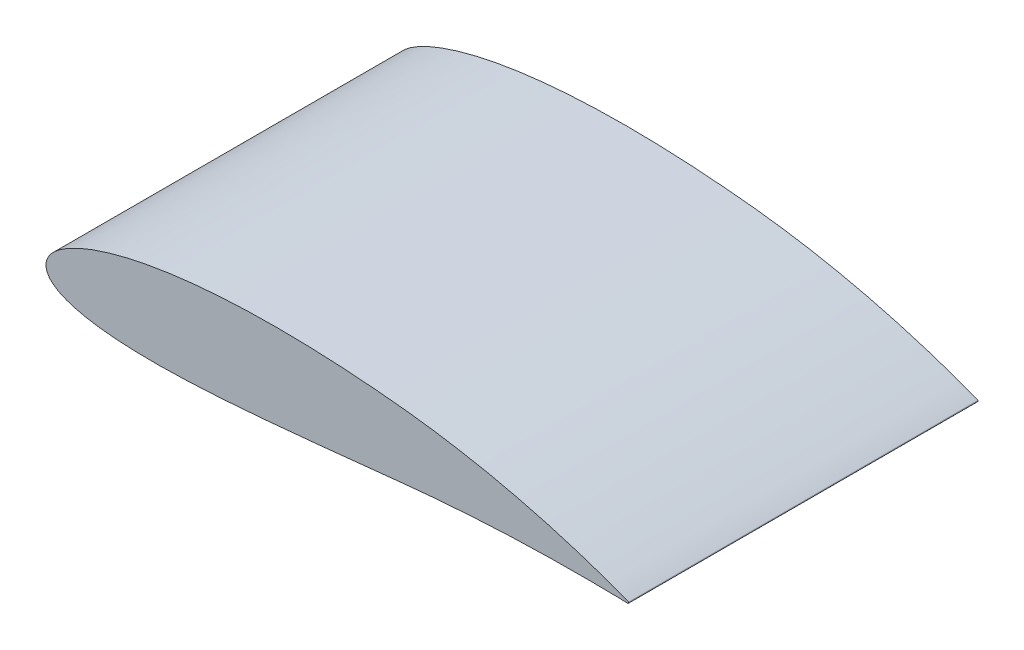
ISO-10303-21;
HEADER;
FILE_DESCRIPTION(('STEP AP214'),'2;1');
FILE_NAME('part.step','',(''),(''),'','','');
FILE_SCHEMA(('AUTOMOTIVE_DESIGN { 1 0 10303 214 1 1 1 1 }'));
ENDSEC;
DATA;
#1=APPLICATION_CONTEXT('core data for automotive mechanical design processes');
#2=APPLICATION_PROTOCOL_DEFINITION('international standard','automotive_design',2000,#1);
#3=PRODUCT_CONTEXT('',#1,'mechanical');
#4=PRODUCT('Part','Part','',(#3));
#5=PRODUCT_RELATED_PRODUCT_CATEGORY('part','',(#4));
#6=PRODUCT_DEFINITION_FORMATION('','',#4);
#7=PRODUCT_DEFINITION_CONTEXT('part definition',#1,'design');
#8=PRODUCT_DEFINITION('design','',#6,#7);
#9=PRODUCT_DEFINITION_SHAPE('','',#8);
#10=(LENGTH_UNIT() NAMED_UNIT(*) SI_UNIT(.MILLI.,.METRE.));
#11=(NAMED_UNIT(*) PLANE_ANGLE_UNIT() SI_UNIT($,.RADIAN.));
#12=(NAMED_UNIT(*) SI_UNIT($,.STERADIAN.) SOLID_ANGLE_UNIT());
#13=UNCERTAINTY_MEASURE_WITH_UNIT(LENGTH_MEASURE(1.E-05),#10,'distance_accuracy_value','');
#14=(GEOMETRIC_REPRESENTATION_CONTEXT(3) GLOBAL_UNCERTAINTY_ASSIGNED_CONTEXT((#13)) GLOBAL_UNIT_ASSIGNED_CONTEXT((#10,
#11,#12)) REPRESENTATION_CONTEXT('',''));
#15=CARTESIAN_POINT('',(0.,0.,0.));
#16=DIRECTION('',(0.,0.,1.));
#17=DIRECTION('',(1.,0.,0.));
#18=AXIS2_PLACEMENT_3D('',#15,#16,#17);
#19=CARTESIAN_POINT('',(179.588060425962,1.51747789828197,90.));
#20=CARTESIAN_POINT('',(179.576980624609,1.523316302043,90.));
#21=CARTESIAN_POINT('',(179.52718097645,1.53857669593602,90.));
#22=CARTESIAN_POINT('',(179.42197092659,1.58260551151804,90.));
#23=CARTESIAN_POINT('',(179.242297710448,1.64950996708991,90.));
#24=CARTESIAN_POINT('',(178.992812632856,1.74528285301178,90.));
#25=CARTESIAN_POINT('',(178.671668193433,1.86709755530364,90.));
#26=CARTESIAN_POINT('',(178.279838926734,2.01521244876782,90.));
#27=CARTESIAN_POINT('',(177.817399271344,2.18913714391106,90.));
#28=CARTESIAN_POINT('',(177.284549147246,2.38784887127666,90.));
#29=CARTESIAN_POINT('',(176.681798515837,2.61102876386751,90.));
#30=CARTESIAN_POINT('',(176.009453986087,2.85747436821653,90.));
#31=CARTESIAN_POINT('',(175.268117897538,3.12642898668492,90.));
#32=CARTESIAN_POINT('',(174.458335755156,3.41720990019241,90.));
#33=CARTESIAN_POINT('',(173.580535126384,3.7282873633377,90.));
#34=CARTESIAN_POINT('',(172.63543923335,4.05885474233654,90.));
#35=CARTESIAN_POINT('',(171.623700851901,4.40762989146076,90.));
#36=CARTESIAN_POINT('',(170.546119436494,4.77345921877464,90.));
#37=CARTESIAN_POINT('',(169.403384346659,5.15471378417027,90.));
#38=CARTESIAN_POINT('',(168.196526464088,5.55038346730584,90.));
#39=CARTESIAN_POINT('',(166.926382857538,5.95888543714597,90.));
#40=CARTESIAN_POINT('',(165.593875432982,6.37856323368897,90.));
#41=CARTESIAN_POINT('',(164.200263192149,6.8085870352401,90.));
#42=CARTESIAN_POINT('',(162.746450213628,7.24683223619169,90.));
#43=CARTESIAN_POINT('',(161.233690439091,7.69186064685437,90.));
#44=CARTESIAN_POINT('',(159.663252029375,8.14236294275537,90.));
#45=CARTESIAN_POINT('',(158.036335518822,8.59644183275585,90.));
#46=CARTESIAN_POINT('',(156.354321049494,9.05278161293172,90.));
#47=CARTESIAN_POINT('',(154.618636873549,9.50956482285903,90.));
#48=CARTESIAN_POINT('',(152.830851068351,9.96560015605514,90.));
#49=CARTESIAN_POINT('',(150.992405700793,10.4186686893723,90.));
#50=CARTESIAN_POINT('',(149.104962138359,10.8676037826853,90.));
#51=CARTESIAN_POINT('',(147.170206680209,11.3108165862247,90.));
#52=CARTESIAN_POINT('',(145.189797122816,11.7465670656761,90.));
#53=CARTESIAN_POINT('',(143.16557343178,12.1734818166424,90.));
#54=CARTESIAN_POINT('',(141.09942148737,12.5900001813686,90.));
#55=CARTESIAN_POINT('',(138.993246948438,12.9946501328825,90.));
#56=CARTESIAN_POINT('',(136.849050518156,13.385943924568,90.));
#57=CARTESIAN_POINT('',(134.668800491964,13.7622904983831,90.));
#58=CARTESIAN_POINT('',(132.454661508084,14.1226735602311,90.));
#59=CARTESIAN_POINT('',(130.208668679293,14.4654022472829,90.));
#60=CARTESIAN_POINT('',(127.933119428744,14.7894265425774,90.));
#61=CARTESIAN_POINT('',(125.63018822343,15.0933429485159,90.));
#62=CARTESIAN_POINT('',(123.302221967674,15.375882879516,90.));
#63=CARTESIAN_POINT('',(120.956559744274,15.6356287669775,90.));
#64=CARTESIAN_POINT('',(118.60313396004,15.8706117225446,90.));
#65=CARTESIAN_POINT('',(116.246049136904,16.0936016936513,90.));
#66=CARTESIAN_POINT('',(113.882670193452,16.299995693498,90.));
#67=CARTESIAN_POINT('',(111.50842693788,16.4908330459839,90.));
#68=CARTESIAN_POINT('',(109.125817650729,16.6654537650282,90.));
#69=CARTESIAN_POINT('',(106.737190282993,16.8224298367708,90.));
#70=CARTESIAN_POINT('',(104.345107652491,16.9619866156201,90.));
#71=CARTESIAN_POINT('',(101.951919344494,17.082770128671,90.));
#72=CARTESIAN_POINT('',(99.560203056175,17.1846394212612,90.));
#73=CARTESIAN_POINT('',(97.1723941956742,17.2668002738033,90.));
#74=CARTESIAN_POINT('',(94.7910523631114,17.3290446870177,90.));
#75=CARTESIAN_POINT('',(92.4186115597152,17.3702650884241,90.));
#76=CARTESIAN_POINT('',(90.0576351601854,17.3906586627168,90.));
#77=CARTESIAN_POINT('',(87.710613598671,17.3896443347206,90.));
#78=CARTESIAN_POINT('',(85.3799999783192,17.3666815320231,90.));
#79=CARTESIAN_POINT('',(83.0682886707022,17.3218232893968,90.));
#80=CARTESIAN_POINT('',(80.7779869568917,17.2545373109455,90.));
#81=CARTESIAN_POINT('',(78.5115278800445,17.165102303431,90.));
#82=CARTESIAN_POINT('',(76.2713316265089,17.0529240451994,90.));
#83=CARTESIAN_POINT('',(74.0597780760123,16.9183942230399,90.));
#84=CARTESIAN_POINT('',(71.8792692355456,16.7614194911275,90.));
#85=CARTESIAN_POINT('',(69.732168693622,16.5819433173491,90.));
#86=CARTESIAN_POINT('',(67.6207016419368,16.3803967351043,90.));
#87=CARTESIAN_POINT('',(65.547227382502,16.1568728844029,90.));
#88=CARTESIAN_POINT('',(63.5139225395676,15.9115302995368,90.));
#89=CARTESIAN_POINT('',(61.5229672422009,15.6453053076087,90.));
#90=CARTESIAN_POINT('',(59.5764166204117,15.3581820240167,90.));
#91=CARTESIAN_POINT('',(57.6764615338846,15.05075724045,90.));
#92=CARTESIAN_POINT('',(55.8250245168226,14.723775809182,90.));
#93=CARTESIAN_POINT('',(54.024129129854,14.3777884422392,90.));
#94=CARTESIAN_POINT('',(52.2755972115926,14.0136298511953,90.));
#95=CARTESIAN_POINT('',(50.581234091081,13.631994061074,90.));
#96=CARTESIAN_POINT('',(48.9428055580629,13.2336112381555,90.));
#97=CARTESIAN_POINT('',(47.3619613436207,12.8195082424192,90.));
#98=CARTESIAN_POINT('',(45.8404440844182,12.3903425146619,90.));
#99=CARTESIAN_POINT('',(44.3795687954237,11.9476280765033,90.));
#100=CARTESIAN_POINT('',(42.9810017187299,11.4917706469217,90.));
#101=CARTESIAN_POINT('',(41.6459871840655,11.0239138147662,90.));
#102=CARTESIAN_POINT('',(40.3758487916129,10.545332843276,90.));
#103=CARTESIAN_POINT('',(39.1717534415434,10.0569234858243,90.));
#104=CARTESIAN_POINT('',(38.0349753815595,9.55954601156469,90.));
#105=CARTESIAN_POINT('',(36.9663746491657,9.05457965809773,90.));
#106=CARTESIAN_POINT('',(35.967057937647,8.54268920940323,90.));
#107=CARTESIAN_POINT('',(35.03780895534,8.02515137014953,90.));
#108=CARTESIAN_POINT('',(34.1794994680508,7.50283664159364,90.));
#109=CARTESIAN_POINT('',(33.3928772266939,6.97661981858108,90.));
#110=CARTESIAN_POINT('',(32.6785340817984,6.44741009207733,90.));
#111=CARTESIAN_POINT('',(32.0366478940157,5.91636427987002,90.));
#112=CARTESIAN_POINT('',(31.4684631329038,5.38346547932532,90.));
#113=CARTESIAN_POINT('',(30.973603754325,4.8501371586821,90.));
#114=CARTESIAN_POINT('',(30.5531468362255,4.31627707984533,90.));
#115=CARTESIAN_POINT('',(30.2068976973957,3.7826589146408,90.));
#116=CARTESIAN_POINT('',(29.935409528338,3.24954527415951,90.));
#117=CARTESIAN_POINT('',(29.7395605383429,2.71712214264119,90.));
#118=CARTESIAN_POINT('',(29.6192161883814,2.1861044884269,90.));
#119=CARTESIAN_POINT('',(29.5756232269495,1.65685654685865,90.));
#120=CARTESIAN_POINT('',(29.6081681789089,1.1326573388293,90.));
#121=CARTESIAN_POINT('',(29.715137627045,0.618483614522129,90.));
#122=CARTESIAN_POINT('',(29.8965298636087,0.119481834420106,90.));
#123=CARTESIAN_POINT('',(30.1516436786802,-0.361168538823704,90.));
#124=CARTESIAN_POINT('',(30.4792120920952,-0.823420629597513,90.));
#125=CARTESIAN_POINT('',(30.8783039490667,-1.26721571236943,90.));
#126=CARTESIAN_POINT('',(31.3484487454433,-1.69240627047484,90.));
#127=CARTESIAN_POINT('',(31.8885905635598,-2.09930466336417,90.));
#128=CARTESIAN_POINT('',(32.4983137524764,-2.48761688439195,90.));
#129=CARTESIAN_POINT('',(33.1766187699149,-2.85782390990594,90.));
#130=CARTESIAN_POINT('',(33.9230046879899,-3.20947510294503,90.));
#131=CARTESIAN_POINT('',(34.73664187443,-3.54240844107671,90.));
#132=CARTESIAN_POINT('',(35.6166304980454,-3.85661809680185,90.));
#133=CARTESIAN_POINT('',(36.5620497471414,-4.15187710835834,90.));
#134=CARTESIAN_POINT('',(37.5719817052443,-4.42787683180949,90.));
#135=CARTESIAN_POINT('',(38.6452627074888,-4.68480219609987,90.));
#136=CARTESIAN_POINT('',(39.7809292686237,-4.92210700321694,90.));
#137=CARTESIAN_POINT('',(40.9777232557723,-5.13997795045349,90.));
#138=CARTESIAN_POINT('',(42.2344381633723,-5.3382331502301,90.));
#139=CARTESIAN_POINT('',(43.5498153875894,-5.51658668114307,90.));
#140=CARTESIAN_POINT('',(44.9224612115907,-5.67539663886376,90.));
#141=CARTESIAN_POINT('',(46.3511237836748,-5.81440246727286,90.));
#142=CARTESIAN_POINT('',(47.8343669830311,-5.93345686590694,90.));
#143=CARTESIAN_POINT('',(49.3707533024137,-6.03323984676768,90.));
#144=CARTESIAN_POINT('',(50.9587913094188,-6.11312121457986,90.));
#145=CARTESIAN_POINT('',(52.5969438960713,-6.173965167776,90.));
#146=CARTESIAN_POINT('',(54.283686438974,-6.21565452571332,90.));
#147=CARTESIAN_POINT('',(56.0174649240415,-6.23868941427056,90.));
#148=CARTESIAN_POINT('',(57.796636814202,-6.24296463201415,90.));
#149=CARTESIAN_POINT('',(59.6196000838952,-6.22930570509925,90.));
#150=CARTESIAN_POINT('',(61.4846135002805,-6.19813074156728,90.));
#151=CARTESIAN_POINT('',(63.3900740707663,-6.14962340833659,90.));
#152=CARTESIAN_POINT('',(65.3341317129076,-6.08441195876659,90.));
#153=CARTESIAN_POINT('',(67.3151078876199,-6.00346380441503,90.));
#154=CARTESIAN_POINT('',(69.3311733060034,-5.90668323019663,90.));
#155=CARTESIAN_POINT('',(71.3805607851276,-5.7953579669814,90.));
#156=CARTESIAN_POINT('',(73.4614050890044,-5.66985158867908,90.));
#157=CARTESIAN_POINT('',(75.5718058173842,-5.53092794832932,90.));
#158=CARTESIAN_POINT('',(77.7099009933688,-5.37976836679352,90.));
#159=CARTESIAN_POINT('',(79.8737708189304,-5.21624266239902,90.));
#160=CARTESIAN_POINT('',(82.0615140202973,-5.04232128185925,90.));
#161=CARTESIAN_POINT('',(84.27112897708,-4.85764110369724,90.));
#162=CARTESIAN_POINT('',(86.5006250321574,-4.6641931842797,90.));
#163=CARTESIAN_POINT('',(88.747946824415,-4.46167866109217,90.));
#164=CARTESIAN_POINT('',(91.0111459775948,-4.25196643468599,90.));
#165=CARTESIAN_POINT('',(93.2880931413097,-4.03511295583256,90.));
#166=CARTESIAN_POINT('',(95.5767608132602,-3.81261464740135,90.));
#167=CARTESIAN_POINT('',(97.8749931102516,-3.58471716158607,90.));
#168=CARTESIAN_POINT('',(100.180778937992,-3.35255021941039,90.));
#169=CARTESIAN_POINT('',(102.491898128025,-3.11673978605144,90.));
#170=CARTESIAN_POINT('',(104.806278063909,-2.87828516691584,90.));
#171=CARTESIAN_POINT('',(107.121648105681,-2.63771507926961,90.));
#172=CARTESIAN_POINT('',(109.435963712341,-2.3957671326494,90.));
#173=CARTESIAN_POINT('',(111.746943310242,-2.15329857006892,90.));
#174=CARTESIAN_POINT('',(114.052473461266,-1.91081507097543,90.));
#175=CARTESIAN_POINT('',(116.350299627856,-1.66880688545112,90.));
#176=CARTESIAN_POINT('',(118.631279434576,-1.42940365011991,90.));
#177=CARTESIAN_POINT('',(120.888261411662,-1.18968856245506,90.));
#178=CARTESIAN_POINT('',(123.120857446721,-0.962674285267962,90.));
#179=CARTESIAN_POINT('',(125.3343870888,-0.747794129429426,90.));
#180=CARTESIAN_POINT('',(127.531724289157,-0.545258837218822,90.));
#181=CARTESIAN_POINT('',(129.710702537571,-0.354545548487856,90.));
#182=CARTESIAN_POINT('',(131.869222751912,-0.176250998946875,90.));
#183=CARTESIAN_POINT('',(134.005127016144,-0.0103200953123819,90.));
#184=CARTESIAN_POINT('',(136.116189312834,0.143710317090611,90.));
#185=CARTESIAN_POINT('',(138.200341607085,0.285611306582739,90.));
#186=CARTESIAN_POINT('',(140.255410230597,0.415882612390504,90.));
#187=CARTESIAN_POINT('',(142.279312567644,0.534518233505038,90.));
#188=CARTESIAN_POINT('',(144.269889544308,0.641927065365058,90.));
#189=CARTESIAN_POINT('',(146.225004174657,0.738250296560521,90.));
#190=CARTESIAN_POINT('',(148.142585788535,0.824324976226929,90.));
#191=CARTESIAN_POINT('',(150.020552167045,0.900247269946321,90.));
#192=CARTESIAN_POINT('',(151.856949609452,0.966525700202279,90.));
#193=CARTESIAN_POINT('',(153.649624253101,1.02378981871957,90.));
#194=CARTESIAN_POINT('',(155.39667890449,1.07250751588598,90.));
#195=CARTESIAN_POINT('',(157.096119716709,1.11295852553331,90.));
#196=CARTESIAN_POINT('',(158.746086421127,1.14616402589815,90.));
#197=CARTESIAN_POINT('',(160.344639462208,1.17226100505099,90.));
#198=CARTESIAN_POINT('',(161.8899700084,1.19236261079927,90.));
#199=CARTESIAN_POINT('',(163.380287604571,1.20638392290866,90.));
#200=CARTESIAN_POINT('',(164.813886622426,1.21532087419241,90.));
#201=CARTESIAN_POINT('',(166.189019377935,1.21973610629602,90.));
#202=CARTESIAN_POINT('',(167.504086566155,1.21999862645697,90.));
#203=CARTESIAN_POINT('',(168.757537892018,1.21674888563664,90.));
#204=CARTESIAN_POINT('',(169.947874366286,1.21062076830366,90.));
#205=CARTESIAN_POINT('',(171.07364646676,1.20203749693789,90.));
#206=CARTESIAN_POINT('',(172.133502857748,1.19137553439895,90.));
#207=CARTESIAN_POINT('',(173.126146200725,1.17936129127043,90.));
#208=CARTESIAN_POINT('',(174.050324530882,1.16630925696159,90.));
#209=CARTESIAN_POINT('',(174.904893859553,1.15290643834868,90.));
#210=CARTESIAN_POINT('',(175.688791520731,1.13885010505375,90.));
#211=CARTESIAN_POINT('',(176.401135509021,1.12546570789178,90.));
#212=CARTESIAN_POINT('',(177.040911671906,1.11226988408586,90.));
#213=CARTESIAN_POINT('',(177.607372593166,1.09995264338642,90.));
#214=CARTESIAN_POINT('',(178.099735569098,1.08875991760871,90.));
#215=CARTESIAN_POINT('',(178.517397535092,1.07892803817132,90.));
#216=CARTESIAN_POINT('',(178.859949330434,1.07024905141203,90.));
#217=CARTESIAN_POINT('',(179.126577336367,1.06448466916703,90.));
#218=CARTESIAN_POINT('',(179.317862463973,1.05774363589079,90.));
#219=CARTESIAN_POINT('',(179.431695842867,1.05794409624931,90.));
#220=CARTESIAN_POINT('',(179.643196103351,1.03868754741647,90.));
#221=CARTESIAN_POINT('',(179.724309793699,1.44568249367945,90.));
#222=CARTESIAN_POINT('',(179.588060425962,1.51747789828197,90.));
#223=B_SPLINE_CURVE_WITH_KNOTS('',3,(#19,#20,#21,#22,#23,#24,#25,#26,#27,#28,#29,#30,#31,#32,
#33,#34,#35,#36,#37,#38,#39,#40,#41,#42,#43,#44,#45,#46,#47,#48,#49,#50,#51,#52,#53,#54,#55,#56,
#57,#58,#59,#60,#61,#62,#63,#64,#65,#66,#67,#68,#69,#70,#71,#72,#73,#74,#75,#76,#77,#78,#79,#80,
#81,#82,#83,#84,#85,#86,#87,#88,#89,#90,#91,#92,#93,#94,#95,#96,#97,#98,#99,#100,#101,#102,#103,
#104,#105,#106,#107,#108,#109,#110,#111,#112,#113,#114,#115,#116,#117,#118,#119,#120,#121,#122,
#123,#124,#125,#126,#127,#128,#129,#130,#131,#132,#133,#134,#135,#136,#137,#138,#139,#140,#141,
#142,#143,#144,#145,#146,#147,#148,#149,#150,#151,#152,#153,#154,#155,#156,#157,#158,#159,#160,
#161,#162,#163,#164,#165,#166,#167,#168,#169,#170,#171,#172,#173,#174,#175,#176,#177,#178,#179,
#180,#181,#182,#183,#184,#185,#186,#187,#188,#189,#190,#191,#192,#193,#194,#195,#196,#197,#198,
#199,#200,#201,#202,#203,#204,#205,#206,#207,#208,#209,#210,#211,#212,#213,#214,#215,#216,#217,
#218,#219,#220,#221,#222),.UNSPECIFIED.,.T.,.F.,(4,1,1,1,1,1,1,1,1,1,1,1,1,1,1,1,1,1,1,1,1,1,1,
1,1,1,1,1,1,1,1,1,1,1,1,1,1,1,1,1,1,1,1,1,1,1,1,1,1,1,1,1,1,1,1,1,1,1,1,1,1,1,1,1,1,1,1,1,1,1,1,
1,1,1,1,1,1,1,1,1,1,1,1,1,1,1,1,1,1,1,1,1,1,1,1,1,1,1,1,1,1,1,1,1,1,1,1,1,1,1,1,1,1,1,1,1,1,1,1,
1,1,1,1,1,1,1,1,1,1,1,1,1,1,1,1,1,1,1,1,1,1,1,1,1,1,1,1,1,1,1,1,1,1,1,1,1,1,1,1,1,1,1,1,1,1,1,1,
1,1,1,1,1,1,1,1,1,1,1,1,1,1,1,1,1,1,1,1,1,1,1,1,1,1,1,1,1,1,1,1,1,1,4),(0.,0.000123822348971543,
0.000494213268962738,0.00111117276581586,0.00197400860776677,0.00308181929485698,
0.00443346667754286,0.0060270844336449,0.00786182747181472,0.00993567137801776,
0.012245642325802,0.0147900223422586,0.0175655764574411,0.0205701235024902,0.0238003023433514,
0.0272526118661918,0.0309240336202863,0.0348103534717856,0.0389076986973114,0.0432119255453823,
0.0477189330710394,0.0524240273173397,0.0573224408682741,0.0624097439897579,0.0676801611153114,
0.0731292245565602,0.078751723007834,0.0845419031176058,0.0904937223170188,0.0966023618805992,
0.10286095879498,0.10926411227723,0.115805905045813,0.122479646894737,0.129279180299753,
0.136197938217693,0.14322942025236,0.1503667206236,0.1576036401866,0.164932929421779,
0.172348035450174,0.179841442371862,0.187406728087781,0.195036152344483,0.20267412106197,
0.210289260155641,0.217942828512715,0.225626790079784,0.233334140398917,0.241056356571423,
0.248786565512649,0.25651683882249,0.264239851081373,0.271947320418904,0.279632469929619,
0.287287089883818,0.294904020524801,0.302475636720048,0.309994362955,0.317453628484056,
0.324845459620496,0.332162383318765,0.339398454205847,0.346546259013378,0.353598448363304,
0.360549171939846,0.367391583933498,0.374119406139032,0.380725883363768,0.387206105061656,
0.393552926098913,0.399762068938507,0.405826762169246,0.411742267574791,0.417503811073585,
0.423106201114434,0.428545261595301,0.43381677740571,0.438916145962763,0.443839518955382,
0.448584628611767,0.453146932061778,0.457524919284413,0.461715436637825,0.465717103765168,
0.469528434180313,0.473148685304782,0.47657820636637,0.479817029730202,0.482866979758924,
0.485731568136363,0.488414700858136,0.490922623374841,0.493262920418435,0.495447220437045,
0.497489228725981,0.499407626443031,0.501223415079954,0.502963898352669,0.504659459568882,
0.506343712209542,0.508027887398582,0.509723263578768,0.511463408143891,0.513276830720093,
0.515191104342679,0.517226443715278,0.519400395953865,0.521726284090529,0.524214151577663,
0.526871935138122,0.529704858362055,0.532716370176169,0.535909607995063,0.539285246411556,
0.542843923852601,0.546585429249946,0.5505088048162,0.554612107407612,0.558893549618391,
0.563350717829745,0.567980355106672,0.572780514874131,0.577746740825989,0.582875766614675,
0.588163823743177,0.593606484418195,0.599199715613851,0.60493938571552,0.610819834612141,
0.616837243861911,0.622985798986026,0.629261051882806,0.635656534414766,0.642167709796924,
0.648788939408742,0.655513612838778,0.662336497162907,0.669251318122071,0.676251383104373,
0.683331718737946,0.690484611626988,0.697704055334406,0.704983257970135,0.712315678164823,
0.719694446677275,0.72711254483677,0.734563078066313,0.742039048404896,0.749533976966668,
0.757039404722128,0.76454936999108,0.772055934203883,0.779552598486816,0.787030988330434,
0.794485132887093,0.801907187496363,0.809220849630608,0.816444387333405,0.823619003868033,
0.830737498543034,0.837793815252522,0.84478128740152,0.851692368717066,0.858521025510163,
0.865260179655733,0.871903294651364,0.878443792728955,0.88487511594374,0.891190211792838,
0.89738254206623,0.903446474014044,0.90937445051991,0.915161330833068,0.920799525585647,
0.926283849226663,0.931608156117751,0.936766263682713,0.941751990310976,0.94656057263711,
0.951185799997091,0.955622409586643,0.959865126354443,0.963909149148839,0.967749665365279,
0.971381855828996,0.974801378150494,0.97800436058017,0.980986446157624,0.983743755760711,
0.986273389809125,0.988571925879152,0.990636951440928,0.992464572273145,0.99405380190107,
0.995401730243562,0.996506884353088,0.997368285619964,0.997984001035304,0.998354018125298,
0.998477344834803,1.),.UNSPECIFIED.);
#224=DIRECTION('',(0.,0.,-1.));
#225=VECTOR('',#224,1.);
#226=SURFACE_OF_LINEAR_EXTRUSION('',#223,#225);
#227=CARTESIAN_POINT('',(179.588060425962,1.51747789828197,90.));
#228=VERTEX_POINT('',#227);
#229=EDGE_CURVE('E10',#228,#228,#223,.T.);
#230=ORIENTED_EDGE('',*,*,#229,.F.);
#231=EDGE_LOOP('',(#230));
#232=FACE_BOUND('',#231,.T.);
#233=CARTESIAN_POINT('',(179.588060425962,1.51747789828197,0.));
#234=CARTESIAN_POINT('',(179.576980624609,1.523316302043,0.));
#235=CARTESIAN_POINT('',(179.52718097645,1.53857669593602,0.));
#236=CARTESIAN_POINT('',(179.42197092659,1.58260551151804,0.));
#237=CARTESIAN_POINT('',(179.242297710448,1.64950996708991,0.));
#238=CARTESIAN_POINT('',(178.992812632856,1.74528285301178,0.));
#239=CARTESIAN_POINT('',(178.671668193433,1.86709755530364,0.));
#240=CARTESIAN_POINT('',(178.279838926734,2.01521244876782,0.));
#241=CARTESIAN_POINT('',(177.817399271344,2.18913714391106,0.));
#242=CARTESIAN_POINT('',(177.284549147246,2.38784887127666,0.));
#243=CARTESIAN_POINT('',(176.681798515837,2.61102876386751,0.));
#244=CARTESIAN_POINT('',(176.009453986087,2.85747436821653,0.));
#245=CARTESIAN_POINT('',(175.268117897538,3.12642898668492,0.));
#246=CARTESIAN_POINT('',(174.458335755156,3.41720990019241,0.));
#247=CARTESIAN_POINT('',(173.580535126384,3.7282873633377,0.));
#248=CARTESIAN_POINT('',(172.63543923335,4.05885474233654,0.));
#249=CARTESIAN_POINT('',(171.623700851901,4.40762989146076,0.));
#250=CARTESIAN_POINT('',(170.546119436494,4.77345921877464,0.));
#251=CARTESIAN_POINT('',(169.403384346659,5.15471378417027,0.));
#252=CARTESIAN_POINT('',(168.196526464088,5.55038346730584,0.));
#253=CARTESIAN_POINT('',(166.926382857538,5.95888543714597,0.));
#254=CARTESIAN_POINT('',(165.593875432982,6.37856323368897,0.));
#255=CARTESIAN_POINT('',(164.200263192149,6.8085870352401,0.));
#256=CARTESIAN_POINT('',(162.746450213628,7.24683223619169,0.));
#257=CARTESIAN_POINT('',(161.233690439091,7.69186064685437,0.));
#258=CARTESIAN_POINT('',(159.663252029375,8.14236294275537,0.));
#259=CARTESIAN_POINT('',(158.036335518822,8.59644183275585,0.));
#260=CARTESIAN_POINT('',(156.354321049494,9.05278161293172,0.));
#261=CARTESIAN_POINT('',(154.618636873549,9.50956482285903,0.));
#262=CARTESIAN_POINT('',(152.830851068351,9.96560015605514,0.));
#263=CARTESIAN_POINT('',(150.992405700793,10.4186686893723,0.));
#264=CARTESIAN_POINT('',(149.104962138359,10.8676037826853,0.));
#265=CARTESIAN_POINT('',(147.170206680209,11.3108165862247,0.));
#266=CARTESIAN_POINT('',(145.189797122816,11.7465670656761,0.));
#267=CARTESIAN_POINT('',(143.16557343178,12.1734818166424,0.));
#268=CARTESIAN_POINT('',(141.09942148737,12.5900001813686,0.));
#269=CARTESIAN_POINT('',(138.993246948438,12.9946501328825,0.));
#270=CARTESIAN_POINT('',(136.849050518156,13.385943924568,0.));
#271=CARTESIAN_POINT('',(134.668800491964,13.7622904983831,0.));
#272=CARTESIAN_POINT('',(132.454661508084,14.1226735602311,0.));
#273=CARTESIAN_POINT('',(130.208668679293,14.4654022472829,0.));
#274=CARTESIAN_POINT('',(127.933119428744,14.7894265425774,0.));
#275=CARTESIAN_POINT('',(125.63018822343,15.0933429485159,0.));
#276=CARTESIAN_POINT('',(123.302221967674,15.375882879516,0.));
#277=CARTESIAN_POINT('',(120.956559744274,15.6356287669775,0.));
#278=CARTESIAN_POINT('',(118.60313396004,15.8706117225446,0.));
#279=CARTESIAN_POINT('',(116.246049136904,16.0936016936513,0.));
#280=CARTESIAN_POINT('',(113.882670193452,16.299995693498,0.));
#281=CARTESIAN_POINT('',(111.50842693788,16.4908330459839,0.));
#282=CARTESIAN_POINT('',(109.125817650729,16.6654537650282,0.));
#283=CARTESIAN_POINT('',(106.737190282993,16.8224298367708,0.));
#284=CARTESIAN_POINT('',(104.345107652491,16.9619866156201,0.));
#285=CARTESIAN_POINT('',(101.951919344494,17.082770128671,0.));
#286=CARTESIAN_POINT('',(99.560203056175,17.1846394212612,0.));
#287=CARTESIAN_POINT('',(97.1723941956742,17.2668002738033,0.));
#288=CARTESIAN_POINT('',(94.7910523631114,17.3290446870177,0.));
#289=CARTESIAN_POINT('',(92.4186115597152,17.3702650884241,0.));
#290=CARTESIAN_POINT('',(90.0576351601854,17.3906586627168,0.));
#291=CARTESIAN_POINT('',(87.710613598671,17.3896443347206,0.));
#292=CARTESIAN_POINT('',(85.3799999783192,17.3666815320231,0.));
#293=CARTESIAN_POINT('',(83.0682886707022,17.3218232893968,0.));
#294=CARTESIAN_POINT('',(80.7779869568917,17.2545373109455,0.));
#295=CARTESIAN_POINT('',(78.5115278800445,17.165102303431,0.));
#296=CARTESIAN_POINT('',(76.2713316265089,17.0529240451994,0.));
#297=CARTESIAN_POINT('',(74.0597780760123,16.9183942230399,0.));
#298=CARTESIAN_POINT('',(71.8792692355456,16.7614194911275,0.));
#299=CARTESIAN_POINT('',(69.732168693622,16.5819433173491,0.));
#300=CARTESIAN_POINT('',(67.6207016419368,16.3803967351043,0.));
#301=CARTESIAN_POINT('',(65.547227382502,16.1568728844029,0.));
#302=CARTESIAN_POINT('',(63.5139225395676,15.9115302995368,0.));
#303=CARTESIAN_POINT('',(61.5229672422009,15.6453053076087,0.));
#304=CARTESIAN_POINT('',(59.5764166204117,15.3581820240167,0.));
#305=CARTESIAN_POINT('',(57.6764615338846,15.05075724045,0.));
#306=CARTESIAN_POINT('',(55.8250245168226,14.723775809182,0.));
#307=CARTESIAN_POINT('',(54.024129129854,14.3777884422392,0.));
#308=CARTESIAN_POINT('',(52.2755972115926,14.0136298511953,0.));
#309=CARTESIAN_POINT('',(50.581234091081,13.631994061074,0.));
#310=CARTESIAN_POINT('',(48.9428055580629,13.2336112381555,0.));
#311=CARTESIAN_POINT('',(47.3619613436207,12.8195082424192,0.));
#312=CARTESIAN_POINT('',(45.8404440844182,12.3903425146619,0.));
#313=CARTESIAN_POINT('',(44.3795687954237,11.9476280765033,0.));
#314=CARTESIAN_POINT('',(42.9810017187299,11.4917706469217,0.));
#315=CARTESIAN_POINT('',(41.6459871840655,11.0239138147662,0.));
#316=CARTESIAN_POINT('',(40.3758487916129,10.545332843276,0.));
#317=CARTESIAN_POINT('',(39.1717534415434,10.0569234858243,0.));
#318=CARTESIAN_POINT('',(38.0349753815595,9.55954601156469,0.));
#319=CARTESIAN_POINT('',(36.9663746491657,9.05457965809773,0.));
#320=CARTESIAN_POINT('',(35.967057937647,8.54268920940323,0.));
#321=CARTESIAN_POINT('',(35.03780895534,8.02515137014953,0.));
#322=CARTESIAN_POINT('',(34.1794994680508,7.50283664159364,0.));
#323=CARTESIAN_POINT('',(33.3928772266939,6.97661981858108,0.));
#324=CARTESIAN_POINT('',(32.6785340817984,6.44741009207733,0.));
#325=CARTESIAN_POINT('',(32.0366478940157,5.91636427987002,0.));
#326=CARTESIAN_POINT('',(31.4684631329038,5.38346547932532,0.));
#327=CARTESIAN_POINT('',(30.973603754325,4.8501371586821,0.));
#328=CARTESIAN_POINT('',(30.5531468362255,4.31627707984533,0.));
#329=CARTESIAN_POINT('',(30.2068976973957,3.7826589146408,0.));
#330=CARTESIAN_POINT('',(29.935409528338,3.24954527415951,0.));
#331=CARTESIAN_POINT('',(29.7395605383429,2.71712214264119,0.));
#332=CARTESIAN_POINT('',(29.6192161883814,2.1861044884269,0.));
#333=CARTESIAN_POINT('',(29.5756232269495,1.65685654685865,0.));
#334=CARTESIAN_POINT('',(29.6081681789089,1.1326573388293,0.));
#335=CARTESIAN_POINT('',(29.715137627045,0.618483614522129,0.));
#336=CARTESIAN_POINT('',(29.8965298636087,0.119481834420106,0.));
#337=CARTESIAN_POINT('',(30.1516436786802,-0.361168538823704,0.));
#338=CARTESIAN_POINT('',(30.4792120920952,-0.823420629597513,0.));
#339=CARTESIAN_POINT('',(30.8783039490667,-1.26721571236943,0.));
#340=CARTESIAN_POINT('',(31.3484487454433,-1.69240627047484,0.));
#341=CARTESIAN_POINT('',(31.8885905635598,-2.09930466336417,0.));
#342=CARTESIAN_POINT('',(32.4983137524764,-2.48761688439195,0.));
#343=CARTESIAN_POINT('',(33.1766187699149,-2.85782390990594,0.));
#344=CARTESIAN_POINT('',(33.9230046879899,-3.20947510294503,0.));
#345=CARTESIAN_POINT('',(34.73664187443,-3.54240844107671,0.));
#346=CARTESIAN_POINT('',(35.6166304980454,-3.85661809680185,0.));
#347=CARTESIAN_POINT('',(36.5620497471414,-4.15187710835834,0.));
#348=CARTESIAN_POINT('',(37.5719817052443,-4.42787683180949,0.));
#349=CARTESIAN_POINT('',(38.6452627074888,-4.68480219609987,0.));
#350=CARTESIAN_POINT('',(39.7809292686237,-4.92210700321694,0.));
#351=CARTESIAN_POINT('',(40.9777232557723,-5.13997795045349,0.));
#352=CARTESIAN_POINT('',(42.2344381633723,-5.3382331502301,0.));
#353=CARTESIAN_POINT('',(43.5498153875894,-5.51658668114307,0.));
#354=CARTESIAN_POINT('',(44.9224612115907,-5.67539663886376,0.));
#355=CARTESIAN_POINT('',(46.3511237836748,-5.81440246727286,0.));
#356=CARTESIAN_POINT('',(47.8343669830311,-5.93345686590694,0.));
#357=CARTESIAN_POINT('',(49.3707533024137,-6.03323984676768,0.));
#358=CARTESIAN_POINT('',(50.9587913094188,-6.11312121457986,0.));
#359=CARTESIAN_POINT('',(52.5969438960713,-6.173965167776,0.));
#360=CARTESIAN_POINT('',(54.283686438974,-6.21565452571332,0.));
#361=CARTESIAN_POINT('',(56.0174649240415,-6.23868941427056,0.));
#362=CARTESIAN_POINT('',(57.796636814202,-6.24296463201415,0.));
#363=CARTESIAN_POINT('',(59.6196000838952,-6.22930570509925,0.));
#364=CARTESIAN_POINT('',(61.4846135002805,-6.19813074156728,0.));
#365=CARTESIAN_POINT('',(63.3900740707663,-6.14962340833659,0.));
#366=CARTESIAN_POINT('',(65.3341317129076,-6.08441195876659,0.));
#367=CARTESIAN_POINT('',(67.3151078876199,-6.00346380441503,0.));
#368=CARTESIAN_POINT('',(69.3311733060034,-5.90668323019663,0.));
#369=CARTESIAN_POINT('',(71.3805607851276,-5.7953579669814,0.));
#370=CARTESIAN_POINT('',(73.4614050890044,-5.66985158867908,0.));
#371=CARTESIAN_POINT('',(75.5718058173842,-5.53092794832932,0.));
#372=CARTESIAN_POINT('',(77.7099009933688,-5.37976836679352,0.));
#373=CARTESIAN_POINT('',(79.8737708189304,-5.21624266239902,0.));
#374=CARTESIAN_POINT('',(82.0615140202973,-5.04232128185925,0.));
#375=CARTESIAN_POINT('',(84.27112897708,-4.85764110369724,0.));
#376=CARTESIAN_POINT('',(86.5006250321574,-4.6641931842797,0.));
#377=CARTESIAN_POINT('',(88.747946824415,-4.46167866109217,0.));
#378=CARTESIAN_POINT('',(91.0111459775948,-4.25196643468599,0.));
#379=CARTESIAN_POINT('',(93.2880931413097,-4.03511295583256,0.));
#380=CARTESIAN_POINT('',(95.5767608132602,-3.81261464740135,0.));
#381=CARTESIAN_POINT('',(97.8749931102516,-3.58471716158607,0.));
#382=CARTESIAN_POINT('',(100.180778937992,-3.35255021941039,0.));
#383=CARTESIAN_POINT('',(102.491898128025,-3.11673978605144,0.));
#384=CARTESIAN_POINT('',(104.806278063909,-2.87828516691584,0.));
#385=CARTESIAN_POINT('',(107.121648105681,-2.63771507926961,0.));
#386=CARTESIAN_POINT('',(109.435963712341,-2.3957671326494,0.));
#387=CARTESIAN_POINT('',(111.746943310242,-2.15329857006892,0.));
#388=CARTESIAN_POINT('',(114.052473461266,-1.91081507097543,0.));
#389=CARTESIAN_POINT('',(116.350299627856,-1.66880688545112,0.));
#390=CARTESIAN_POINT('',(118.631279434576,-1.42940365011991,0.));
#391=CARTESIAN_POINT('',(120.888261411662,-1.18968856245506,0.));
#392=CARTESIAN_POINT('',(123.120857446721,-0.962674285267962,0.));
#393=CARTESIAN_POINT('',(125.3343870888,-0.747794129429426,0.));
#394=CARTESIAN_POINT('',(127.531724289157,-0.545258837218822,0.));
#395=CARTESIAN_POINT('',(129.710702537571,-0.354545548487856,0.));
#396=CARTESIAN_POINT('',(131.869222751912,-0.176250998946875,0.));
#397=CARTESIAN_POINT('',(134.005127016144,-0.0103200953123819,0.));
#398=CARTESIAN_POINT('',(136.116189312834,0.143710317090611,0.));
#399=CARTESIAN_POINT('',(138.200341607085,0.285611306582739,0.));
#400=CARTESIAN_POINT('',(140.255410230597,0.415882612390504,0.));
#401=CARTESIAN_POINT('',(142.279312567644,0.534518233505038,0.));
#402=CARTESIAN_POINT('',(144.269889544308,0.641927065365058,0.));
#403=CARTESIAN_POINT('',(146.225004174657,0.738250296560521,0.));
#404=CARTESIAN_POINT('',(148.142585788535,0.824324976226929,0.));
#405=CARTESIAN_POINT('',(150.020552167045,0.900247269946321,0.));
#406=CARTESIAN_POINT('',(151.856949609452,0.966525700202279,0.));
#407=CARTESIAN_POINT('',(153.649624253101,1.02378981871957,0.));
#408=CARTESIAN_POINT('',(155.39667890449,1.07250751588598,0.));
#409=CARTESIAN_POINT('',(157.096119716709,1.11295852553331,0.));
#410=CARTESIAN_POINT('',(158.746086421127,1.14616402589815,0.));
#411=CARTESIAN_POINT('',(160.344639462208,1.17226100505099,0.));
#412=CARTESIAN_POINT('',(161.8899700084,1.19236261079927,0.));
#413=CARTESIAN_POINT('',(163.380287604571,1.20638392290866,0.));
#414=CARTESIAN_POINT('',(164.813886622426,1.21532087419241,0.));
#415=CARTESIAN_POINT('',(166.189019377935,1.21973610629602,0.));
#416=CARTESIAN_POINT('',(167.504086566155,1.21999862645697,0.));
#417=CARTESIAN_POINT('',(168.757537892018,1.21674888563664,0.));
#418=CARTESIAN_POINT('',(169.947874366286,1.21062076830366,0.));
#419=CARTESIAN_POINT('',(171.07364646676,1.20203749693789,0.));
#420=CARTESIAN_POINT('',(172.133502857748,1.19137553439895,0.));
#421=CARTESIAN_POINT('',(173.126146200725,1.17936129127043,0.));
#422=CARTESIAN_POINT('',(174.050324530882,1.16630925696159,0.));
#423=CARTESIAN_POINT('',(174.904893859553,1.15290643834868,0.));
#424=CARTESIAN_POINT('',(175.688791520731,1.13885010505375,0.));
#425=CARTESIAN_POINT('',(176.401135509021,1.12546570789178,0.));
#426=CARTESIAN_POINT('',(177.040911671906,1.11226988408586,0.));
#427=CARTESIAN_POINT('',(177.607372593166,1.09995264338642,0.));
#428=CARTESIAN_POINT('',(178.099735569098,1.08875991760871,0.));
#429=CARTESIAN_POINT('',(178.517397535092,1.07892803817132,0.));
#430=CARTESIAN_POINT('',(178.859949330434,1.07024905141203,0.));
#431=CARTESIAN_POINT('',(179.126577336367,1.06448466916703,0.));
#432=CARTESIAN_POINT('',(179.317862463973,1.05774363589079,0.));
#433=CARTESIAN_POINT('',(179.431695842867,1.05794409624931,0.));
#434=CARTESIAN_POINT('',(179.643196103351,1.03868754741647,0.));
#435=CARTESIAN_POINT('',(179.724309793699,1.44568249367945,0.));
#436=CARTESIAN_POINT('',(179.588060425962,1.51747789828197,0.));
#437=B_SPLINE_CURVE_WITH_KNOTS('',3,(#233,#234,#235,#236,#237,#238,#239,#240,#241,#242,#243,
#244,#245,#246,#247,#248,#249,#250,#251,#252,#253,#254,#255,#256,#257,#258,#259,#260,#261,#262,
#263,#264,#265,#266,#267,#268,#269,#270,#271,#272,#273,#274,#275,#276,#277,#278,#279,#280,#281,
#282,#283,#284,#285,#286,#287,#288,#289,#290,#291,#292,#293,#294,#295,#296,#297,#298,#299,#300,
#301,#302,#303,#304,#305,#306,#307,#308,#309,#310,#311,#312,#313,#314,#315,#316,#317,#318,#319,
#320,#321,#322,#323,#324,#325,#326,#327,#328,#329,#330,#331,#332,#333,#334,#335,#336,#337,#338,
#339,#340,#341,#342,#343,#344,#345,#346,#347,#348,#349,#350,#351,#352,#353,#354,#355,#356,#357,
#358,#359,#360,#361,#362,#363,#364,#365,#366,#367,#368,#369,#370,#371,#372,#373,#374,#375,#376,
#377,#378,#379,#380,#381,#382,#383,#384,#385,#386,#387,#388,#389,#390,#391,#392,#393,#394,#395,
#396,#397,#398,#399,#400,#401,#402,#403,#404,#405,#406,#407,#408,#409,#410,#411,#412,#413,#414,
#415,#416,#417,#418,#419,#420,#421,#422,#423,#424,#425,#426,#427,#428,#429,#430,#431,#432,#433,
#434,#435,#436),.UNSPECIFIED.,.T.,.F.,(4,1,1,1,1,1,1,1,1,1,1,1,1,1,1,1,1,1,1,1,1,1,1,1,1,1,1,1,
1,1,1,1,1,1,1,1,1,1,1,1,1,1,1,1,1,1,1,1,1,1,1,1,1,1,1,1,1,1,1,1,1,1,1,1,1,1,1,1,1,1,1,1,1,1,1,1,
1,1,1,1,1,1,1,1,1,1,1,1,1,1,1,1,1,1,1,1,1,1,1,1,1,1,1,1,1,1,1,1,1,1,1,1,1,1,1,1,1,1,1,1,1,1,1,1,
1,1,1,1,1,1,1,1,1,1,1,1,1,1,1,1,1,1,1,1,1,1,1,1,1,1,1,1,1,1,1,1,1,1,1,1,1,1,1,1,1,1,1,1,1,1,1,1,
1,1,1,1,1,1,1,1,1,1,1,1,1,1,1,1,1,1,1,1,1,1,1,1,1,1,1,1,1,4),(0.,0.000123822348971543,
0.000494213268962738,0.00111117276581586,0.00197400860776677,0.00308181929485698,
0.00443346667754286,0.0060270844336449,0.00786182747181472,0.00993567137801776,
0.012245642325802,0.0147900223422586,0.0175655764574411,0.0205701235024902,0.0238003023433514,
0.0272526118661918,0.0309240336202863,0.0348103534717856,0.0389076986973114,0.0432119255453823,
0.0477189330710394,0.0524240273173397,0.0573224408682741,0.0624097439897579,0.0676801611153114,
0.0731292245565602,0.078751723007834,0.0845419031176058,0.0904937223170188,0.0966023618805992,
0.10286095879498,0.10926411227723,0.115805905045813,0.122479646894737,0.129279180299753,
0.136197938217693,0.14322942025236,0.1503667206236,0.1576036401866,0.164932929421779,
0.172348035450174,0.179841442371862,0.187406728087781,0.195036152344483,0.20267412106197,
0.210289260155641,0.217942828512715,0.225626790079784,0.233334140398917,0.241056356571423,
0.248786565512649,0.25651683882249,0.264239851081373,0.271947320418904,0.279632469929619,
0.287287089883818,0.294904020524801,0.302475636720048,0.309994362955,0.317453628484056,
0.324845459620496,0.332162383318765,0.339398454205847,0.346546259013378,0.353598448363304,
0.360549171939846,0.367391583933498,0.374119406139032,0.380725883363768,0.387206105061656,
0.393552926098913,0.399762068938507,0.405826762169246,0.411742267574791,0.417503811073585,
0.423106201114434,0.428545261595301,0.43381677740571,0.438916145962763,0.443839518955382,
0.448584628611767,0.453146932061778,0.457524919284413,0.461715436637825,0.465717103765168,
0.469528434180313,0.473148685304782,0.47657820636637,0.479817029730202,0.482866979758924,
0.485731568136363,0.488414700858136,0.490922623374841,0.493262920418435,0.495447220437045,
0.497489228725981,0.499407626443031,0.501223415079954,0.502963898352669,0.504659459568882,
0.506343712209542,0.508027887398582,0.509723263578768,0.511463408143891,0.513276830720093,
0.515191104342679,0.517226443715278,0.519400395953865,0.521726284090529,0.524214151577663,
0.526871935138122,0.529704858362055,0.532716370176169,0.535909607995063,0.539285246411556,
0.542843923852601,0.546585429249946,0.5505088048162,0.554612107407612,0.558893549618391,
0.563350717829745,0.567980355106672,0.572780514874131,0.577746740825989,0.582875766614675,
0.588163823743177,0.593606484418195,0.599199715613851,0.60493938571552,0.610819834612141,
0.616837243861911,0.622985798986026,0.629261051882806,0.635656534414766,0.642167709796924,
0.648788939408742,0.655513612838778,0.662336497162907,0.669251318122071,0.676251383104373,
0.683331718737946,0.690484611626988,0.697704055334406,0.704983257970135,0.712315678164823,
0.719694446677275,0.72711254483677,0.734563078066313,0.742039048404896,0.749533976966668,
0.757039404722128,0.76454936999108,0.772055934203883,0.779552598486816,0.787030988330434,
0.794485132887093,0.801907187496363,0.809220849630608,0.816444387333405,0.823619003868033,
0.830737498543034,0.837793815252522,0.84478128740152,0.851692368717066,0.858521025510163,
0.865260179655733,0.871903294651364,0.878443792728955,0.88487511594374,0.891190211792838,
0.89738254206623,0.903446474014044,0.90937445051991,0.915161330833068,0.920799525585647,
0.926283849226663,0.931608156117751,0.936766263682713,0.941751990310976,0.94656057263711,
0.951185799997091,0.955622409586643,0.959865126354443,0.963909149148839,0.967749665365279,
0.971381855828996,0.974801378150494,0.97800436058017,0.980986446157624,0.983743755760711,
0.986273389809125,0.988571925879152,0.990636951440928,0.992464572273145,0.99405380190107,
0.995401730243562,0.996506884353088,0.997368285619964,0.997984001035304,0.998354018125298,
0.998477344834803,1.),.UNSPECIFIED.);
#438=CARTESIAN_POINT('',(179.588060425962,1.51747789828197,0.));
#439=VERTEX_POINT('',#438);
#440=EDGE_CURVE('E47',#439,#439,#437,.T.);
#441=ORIENTED_EDGE('',*,*,#440,.T.);
#442=EDGE_LOOP('',(#441));
#443=FACE_BOUND('',#442,.T.);
#444=ADVANCED_FACE('F43',(#232,#443),#226,.F.);
#445=CARTESIAN_POINT('',(29.8716107551468,3.06527466063631,90.));
#446=DIRECTION('',(0.,0.,-1.));
#447=DIRECTION('',(-1.,0.,0.));
#448=AXIS2_PLACEMENT_3D('',#445,#446,#447);
#449=PLANE('',#448);
#450=ORIENTED_EDGE('',*,*,#229,.T.);
#451=EDGE_LOOP('',(#450));
#452=FACE_BOUND('',#451,.T.);
#453=ADVANCED_FACE('F68',(#452),#449,.F.);
#454=CARTESIAN_POINT('',(29.8716107551468,3.06527466063631,0.));
#455=DIRECTION('',(0.,0.,-1.));
#456=DIRECTION('',(-1.,0.,0.));
#457=AXIS2_PLACEMENT_3D('',#454,#455,#456);
#458=PLANE('',#457);
#459=ORIENTED_EDGE('',*,*,#440,.F.);
#460=EDGE_LOOP('',(#459));
#461=FACE_BOUND('',#460,.T.);
#462=ADVANCED_FACE('F66',(#461),#458,.T.);
#463=CLOSED_SHELL('',(#444,#453,#462));
#464=MANIFOLD_SOLID_BREP('B2',#463);
#465=ADVANCED_BREP_SHAPE_REPRESENTATION('',(#18,#464),#14);
#466=SHAPE_DEFINITION_REPRESENTATION(#9,#465);
ENDSEC;
END-ISO-10303-21;
